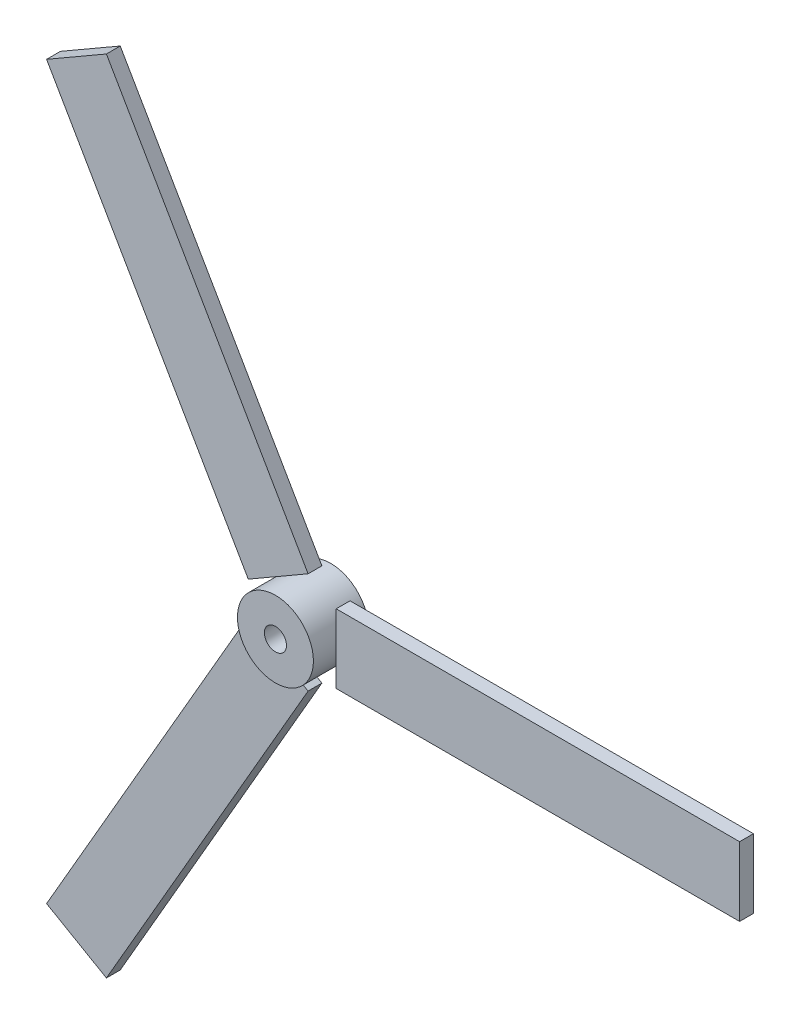
ISO-10303-21;
HEADER;
FILE_DESCRIPTION(('STEP AP214'),'2;1');
FILE_NAME('part.step','',(''),(''),'','','');
FILE_SCHEMA(('AUTOMOTIVE_DESIGN { 1 0 10303 214 1 1 1 1 }'));
ENDSEC;
DATA;
#1=APPLICATION_CONTEXT('core data for automotive mechanical design processes');
#2=APPLICATION_PROTOCOL_DEFINITION('international standard','automotive_design',2000,#1);
#3=PRODUCT_CONTEXT('',#1,'mechanical');
#4=PRODUCT('Part','Part','',(#3));
#5=PRODUCT_RELATED_PRODUCT_CATEGORY('part','',(#4));
#6=PRODUCT_DEFINITION_FORMATION('','',#4);
#7=PRODUCT_DEFINITION_CONTEXT('part definition',#1,'design');
#8=PRODUCT_DEFINITION('design','',#6,#7);
#9=PRODUCT_DEFINITION_SHAPE('','',#8);
#10=(LENGTH_UNIT() NAMED_UNIT(*) SI_UNIT(.MILLI.,.METRE.));
#11=(NAMED_UNIT(*) PLANE_ANGLE_UNIT() SI_UNIT($,.RADIAN.));
#12=(NAMED_UNIT(*) SI_UNIT($,.STERADIAN.) SOLID_ANGLE_UNIT());
#13=UNCERTAINTY_MEASURE_WITH_UNIT(LENGTH_MEASURE(1.E-05),#10,'distance_accuracy_value','');
#14=(GEOMETRIC_REPRESENTATION_CONTEXT(3) GLOBAL_UNCERTAINTY_ASSIGNED_CONTEXT((#13)) GLOBAL_UNIT_ASSIGNED_CONTEXT((#10,
#11,#12)) REPRESENTATION_CONTEXT('',''));
#15=CARTESIAN_POINT('',(0.,0.,0.));
#16=DIRECTION('',(0.,0.,1.));
#17=DIRECTION('',(1.,0.,0.));
#18=AXIS2_PLACEMENT_3D('',#15,#16,#17);
#19=CARTESIAN_POINT('',(45.573032047473,45.573032047473,13.4));
#20=DIRECTION('',(0.,0.,1.));
#21=DIRECTION('',(1.,0.,0.));
#22=AXIS2_PLACEMENT_3D('',#19,#20,#21);
#23=PLANE('',#22);
#24=CARTESIAN_POINT('',(45.573032047473,45.573032047473,13.4));
#25=DIRECTION('',(0.,0.,1.));
#26=DIRECTION('',(1.,0.,0.));
#27=AXIS2_PLACEMENT_3D('',#24,#25,#26);
#28=CIRCLE('',#27,0.8);
#29=CARTESIAN_POINT('',(46.373032047473,45.573032047473,13.4));
#30=VERTEX_POINT('',#29);
#31=EDGE_CURVE('P0_E27',#30,#30,#28,.T.);
#32=ORIENTED_EDGE('',*,*,#31,.F.);
#33=EDGE_LOOP('',(#32));
#34=FACE_BOUND('',#33,.T.);
#35=CARTESIAN_POINT('',(45.573032047473,45.573032047473,13.4));
#36=DIRECTION('',(0.,0.,1.));
#37=DIRECTION('',(1.,0.,0.));
#38=AXIS2_PLACEMENT_3D('',#35,#36,#37);
#39=CIRCLE('',#38,2.75);
#40=CARTESIAN_POINT('',(48.323032047473,45.573032047473,13.4));
#41=VERTEX_POINT('',#40);
#42=EDGE_CURVE('P0_E56',#41,#41,#39,.T.);
#43=ORIENTED_EDGE('',*,*,#42,.T.);
#44=EDGE_LOOP('',(#43));
#45=FACE_BOUND('',#44,.T.);
#46=ADVANCED_FACE('P0_F17',(#34,#45),#23,.T.);
#47=CARTESIAN_POINT('',(45.573032047473,45.573032047473,9.4));
#48=DIRECTION('',(0.,0.,1.));
#49=DIRECTION('',(1.,0.,0.));
#50=AXIS2_PLACEMENT_3D('',#47,#48,#49);
#51=PLANE('',#50);
#52=CARTESIAN_POINT('',(45.573032047473,45.573032047473,9.4));
#53=DIRECTION('',(0.,0.,1.));
#54=DIRECTION('',(1.,0.,0.));
#55=AXIS2_PLACEMENT_3D('',#52,#53,#54);
#56=CIRCLE('',#55,0.8);
#57=CARTESIAN_POINT('',(46.373032047473,45.573032047473,9.4));
#58=VERTEX_POINT('',#57);
#59=EDGE_CURVE('P0_E11',#58,#58,#56,.T.);
#60=ORIENTED_EDGE('',*,*,#59,.T.);
#61=EDGE_LOOP('',(#60));
#62=FACE_BOUND('',#61,.T.);
#63=CARTESIAN_POINT('',(45.573032047473,45.573032047473,9.4));
#64=DIRECTION('',(0.,0.,1.));
#65=DIRECTION('',(1.,0.,0.));
#66=AXIS2_PLACEMENT_3D('',#63,#64,#65);
#67=CIRCLE('',#66,2.75);
#68=CARTESIAN_POINT('',(48.323032047473,45.573032047473,9.4));
#69=VERTEX_POINT('',#68);
#70=EDGE_CURVE('P0_E59',#69,#69,#67,.T.);
#71=ORIENTED_EDGE('',*,*,#70,.F.);
#72=EDGE_LOOP('',(#71));
#73=FACE_BOUND('',#72,.T.);
#74=ADVANCED_FACE('P0_F19',(#62,#73),#51,.F.);
#75=CARTESIAN_POINT('',(45.573032047473,45.573032047473,9.4));
#76=DIRECTION('',(0.,0.,-1.));
#77=DIRECTION('',(1.,0.,0.));
#78=AXIS2_PLACEMENT_3D('',#75,#76,#77);
#79=CYLINDRICAL_SURFACE('',#78,0.8);
#80=DIRECTION('',(0.,0.,1.));
#81=VECTOR('',#80,1.);
#82=CARTESIAN_POINT('',(46.373032047473,45.573032047473,9.4));
#83=LINE('',#82,#81);
#84=EDGE_CURVE('P0_E65',#58,#30,#83,.T.);
#85=ORIENTED_EDGE('',*,*,#84,.T.);
#86=ORIENTED_EDGE('',*,*,#31,.T.);
#87=ORIENTED_EDGE('',*,*,#84,.F.);
#88=ORIENTED_EDGE('',*,*,#59,.F.);
#89=EDGE_LOOP('',(#85,#86,#87,#88));
#90=FACE_BOUND('',#89,.T.);
#91=ADVANCED_FACE('P0_F82',(#90),#79,.F.);
#92=CARTESIAN_POINT('',(45.573032047473,45.573032047473,9.4));
#93=DIRECTION('',(0.,0.,-1.));
#94=DIRECTION('',(1.,0.,0.));
#95=AXIS2_PLACEMENT_3D('',#92,#93,#94);
#96=CYLINDRICAL_SURFACE('',#95,2.75);
#97=ORIENTED_EDGE('',*,*,#70,.T.);
#98=DIRECTION('',(0.,0.,1.));
#99=VECTOR('',#98,1.);
#100=CARTESIAN_POINT('',(48.323032047473,45.573032047473,9.4));
#101=LINE('',#100,#99);
#102=EDGE_CURVE('P0_E54',#69,#41,#101,.T.);
#103=ORIENTED_EDGE('',*,*,#102,.T.);
#104=ORIENTED_EDGE('',*,*,#42,.F.);
#105=ORIENTED_EDGE('',*,*,#102,.F.);
#106=EDGE_LOOP('',(#97,#103,#104,#105));
#107=FACE_BOUND('',#106,.T.);
#108=ADVANCED_FACE('P0_F57',(#107),#96,.T.);
#109=CLOSED_SHELL('',(#46,#74,#91,#108));
#110=MANIFOLD_SOLID_BREP('P0_B1',#109);
#111=CARTESIAN_POINT('',(62.973032047473,45.573032047473,11.8));
#112=DIRECTION('',(0.,0.,1.));
#113=DIRECTION('',(1.,0.,0.));
#114=AXIS2_PLACEMENT_3D('',#111,#112,#113);
#115=PLANE('',#114);
#116=DIRECTION('',(1.,0.,0.));
#117=VECTOR('',#116,1.);
#118=CARTESIAN_POINT('',(48.373032047473,43.073032047473,11.8));
#119=LINE('',#118,#117);
#120=CARTESIAN_POINT('',(48.373032047473,43.073032047473,11.8));
#121=VERTEX_POINT('',#120);
#122=CARTESIAN_POINT('',(77.573032047473,43.073032047473,11.8));
#123=VERTEX_POINT('',#122);
#124=EDGE_CURVE('P1_E81',#121,#123,#119,.T.);
#125=ORIENTED_EDGE('',*,*,#124,.T.);
#126=DIRECTION('',(0.,1.,0.));
#127=VECTOR('',#126,1.);
#128=CARTESIAN_POINT('',(77.573032047473,43.073032047473,11.8));
#129=LINE('',#128,#127);
#130=CARTESIAN_POINT('',(77.573032047473,48.073032047473,11.8));
#131=VERTEX_POINT('',#130);
#132=EDGE_CURVE('P1_E103',#123,#131,#129,.T.);
#133=ORIENTED_EDGE('',*,*,#132,.T.);
#134=DIRECTION('',(-1.,0.,0.));
#135=VECTOR('',#134,1.);
#136=CARTESIAN_POINT('',(77.573032047473,48.073032047473,11.8));
#137=LINE('',#136,#135);
#138=CARTESIAN_POINT('',(48.373032047473,48.073032047473,11.8));
#139=VERTEX_POINT('',#138);
#140=EDGE_CURVE('P1_E72',#131,#139,#137,.T.);
#141=ORIENTED_EDGE('',*,*,#140,.T.);
#142=DIRECTION('',(0.,-1.,0.));
#143=VECTOR('',#142,1.);
#144=CARTESIAN_POINT('',(48.373032047473,48.073032047473,11.8));
#145=LINE('',#144,#143);
#146=EDGE_CURVE('P1_E11',#139,#121,#145,.T.);
#147=ORIENTED_EDGE('',*,*,#146,.T.);
#148=EDGE_LOOP('',(#125,#133,#141,#147));
#149=FACE_BOUND('',#148,.T.);
#150=ADVANCED_FACE('P1_F17',(#149),#115,.T.);
#151=CARTESIAN_POINT('',(62.973032047473,45.573032047473,10.8));
#152=DIRECTION('',(0.,0.,1.));
#153=DIRECTION('',(1.,0.,0.));
#154=AXIS2_PLACEMENT_3D('',#151,#152,#153);
#155=PLANE('',#154);
#156=DIRECTION('',(0.,-1.,0.));
#157=VECTOR('',#156,1.);
#158=CARTESIAN_POINT('',(48.373032047473,48.073032047473,10.8));
#159=LINE('',#158,#157);
#160=CARTESIAN_POINT('',(48.373032047473,48.073032047473,10.8));
#161=VERTEX_POINT('',#160);
#162=CARTESIAN_POINT('',(48.373032047473,43.073032047473,10.8));
#163=VERTEX_POINT('',#162);
#164=EDGE_CURVE('P1_E20',#161,#163,#159,.T.);
#165=ORIENTED_EDGE('',*,*,#164,.F.);
#166=DIRECTION('',(-1.,0.,0.));
#167=VECTOR('',#166,1.);
#168=CARTESIAN_POINT('',(77.573032047473,48.073032047473,10.8));
#169=LINE('',#168,#167);
#170=CARTESIAN_POINT('',(77.573032047473,48.073032047473,10.8));
#171=VERTEX_POINT('',#170);
#172=EDGE_CURVE('P1_E110',#171,#161,#169,.T.);
#173=ORIENTED_EDGE('',*,*,#172,.F.);
#174=DIRECTION('',(0.,1.,0.));
#175=VECTOR('',#174,1.);
#176=CARTESIAN_POINT('',(77.573032047473,43.073032047473,10.8));
#177=LINE('',#176,#175);
#178=CARTESIAN_POINT('',(77.573032047473,43.073032047473,10.8));
#179=VERTEX_POINT('',#178);
#180=EDGE_CURVE('P1_E83',#179,#171,#177,.T.);
#181=ORIENTED_EDGE('',*,*,#180,.F.);
#182=DIRECTION('',(1.,0.,0.));
#183=VECTOR('',#182,1.);
#184=CARTESIAN_POINT('',(48.373032047473,43.073032047473,10.8));
#185=LINE('',#184,#183);
#186=EDGE_CURVE('P1_E78',#163,#179,#185,.T.);
#187=ORIENTED_EDGE('',*,*,#186,.F.);
#188=EDGE_LOOP('',(#165,#173,#181,#187));
#189=FACE_BOUND('',#188,.T.);
#190=ADVANCED_FACE('P1_F84',(#189),#155,.F.);
#191=CARTESIAN_POINT('',(48.373032047473,48.073032047473,10.8));
#192=DIRECTION('',(1.,0.,0.));
#193=DIRECTION('',(0.,1.,0.));
#194=AXIS2_PLACEMENT_3D('',#191,#192,#193);
#195=PLANE('',#194);
#196=ORIENTED_EDGE('',*,*,#164,.T.);
#197=DIRECTION('',(0.,0.,1.));
#198=VECTOR('',#197,1.);
#199=CARTESIAN_POINT('',(48.373032047473,43.073032047473,10.8));
#200=LINE('',#199,#198);
#201=EDGE_CURVE('P1_E68',#163,#121,#200,.T.);
#202=ORIENTED_EDGE('',*,*,#201,.T.);
#203=ORIENTED_EDGE('',*,*,#146,.F.);
#204=DIRECTION('',(0.,0.,1.));
#205=VECTOR('',#204,1.);
#206=CARTESIAN_POINT('',(48.373032047473,48.073032047473,10.8));
#207=LINE('',#206,#205);
#208=EDGE_CURVE('P1_E75',#161,#139,#207,.T.);
#209=ORIENTED_EDGE('',*,*,#208,.F.);
#210=EDGE_LOOP('',(#196,#202,#203,#209));
#211=FACE_BOUND('',#210,.T.);
#212=ADVANCED_FACE('P1_F70',(#211),#195,.F.);
#213=CARTESIAN_POINT('',(77.573032047473,48.073032047473,10.8));
#214=DIRECTION('',(0.,-1.,0.));
#215=DIRECTION('',(0.,0.,-1.));
#216=AXIS2_PLACEMENT_3D('',#213,#214,#215);
#217=PLANE('',#216);
#218=ORIENTED_EDGE('',*,*,#172,.T.);
#219=ORIENTED_EDGE('',*,*,#208,.T.);
#220=ORIENTED_EDGE('',*,*,#140,.F.);
#221=DIRECTION('',(0.,0.,1.));
#222=VECTOR('',#221,1.);
#223=CARTESIAN_POINT('',(77.573032047473,48.073032047473,10.8));
#224=LINE('',#223,#222);
#225=EDGE_CURVE('P1_E97',#171,#131,#224,.T.);
#226=ORIENTED_EDGE('',*,*,#225,.F.);
#227=EDGE_LOOP('',(#218,#219,#220,#226));
#228=FACE_BOUND('',#227,.T.);
#229=ADVANCED_FACE('P1_F117',(#228),#217,.F.);
#230=CARTESIAN_POINT('',(77.573032047473,43.073032047473,10.8));
#231=DIRECTION('',(-1.,0.,0.));
#232=DIRECTION('',(0.,0.,1.));
#233=AXIS2_PLACEMENT_3D('',#230,#231,#232);
#234=PLANE('',#233);
#235=ORIENTED_EDGE('',*,*,#180,.T.);
#236=ORIENTED_EDGE('',*,*,#225,.T.);
#237=ORIENTED_EDGE('',*,*,#132,.F.);
#238=DIRECTION('',(0.,0.,1.));
#239=VECTOR('',#238,1.);
#240=CARTESIAN_POINT('',(77.573032047473,43.073032047473,10.8));
#241=LINE('',#240,#239);
#242=EDGE_CURVE('P1_E90',#179,#123,#241,.T.);
#243=ORIENTED_EDGE('',*,*,#242,.F.);
#244=EDGE_LOOP('',(#235,#236,#237,#243));
#245=FACE_BOUND('',#244,.T.);
#246=ADVANCED_FACE('P1_F118',(#245),#234,.F.);
#247=CARTESIAN_POINT('',(48.373032047473,43.073032047473,10.8));
#248=DIRECTION('',(0.,1.,0.));
#249=DIRECTION('',(1.,0.,0.));
#250=AXIS2_PLACEMENT_3D('',#247,#248,#249);
#251=PLANE('',#250);
#252=ORIENTED_EDGE('',*,*,#186,.T.);
#253=ORIENTED_EDGE('',*,*,#242,.T.);
#254=ORIENTED_EDGE('',*,*,#124,.F.);
#255=ORIENTED_EDGE('',*,*,#201,.F.);
#256=EDGE_LOOP('',(#252,#253,#254,#255));
#257=FACE_BOUND('',#256,.T.);
#258=ADVANCED_FACE('P1_F80',(#257),#251,.F.);
#259=CLOSED_SHELL('',(#150,#190,#212,#229,#246,#258));
#260=MANIFOLD_SOLID_BREP('P1_B1',#259);
#261=CARTESIAN_POINT('',(36.873032047473,60.641874073322,11.8));
#262=DIRECTION('',(0.,0.,1.));
#263=DIRECTION('',(1.,0.,0.));
#264=AXIS2_PLACEMENT_3D('',#261,#262,#263);
#265=PLANE('',#264);
#266=DIRECTION('',(-0.50000000000019,0.866025403784329,0.));
#267=VECTOR('',#266,1.);
#268=CARTESIAN_POINT('',(46.338095556934,49.247903178069,11.8));
#269=LINE('',#268,#267);
#270=CARTESIAN_POINT('',(46.338095556934,49.247903178069,11.8));
#271=VERTEX_POINT('',#270);
#272=CARTESIAN_POINT('',(31.738095556934,74.535844968575,11.8));
#273=VERTEX_POINT('',#272);
#274=EDGE_CURVE('P2_E98',#271,#273,#269,.T.);
#275=ORIENTED_EDGE('',*,*,#274,.T.);
#276=DIRECTION('',(-0.866025403784329,-0.50000000000019,0.));
#277=VECTOR('',#276,1.);
#278=CARTESIAN_POINT('',(31.738095556934,74.535844968575,11.8));
#279=LINE('',#278,#277);
#280=CARTESIAN_POINT('',(27.407968538012,72.035844968575,11.8));
#281=VERTEX_POINT('',#280);
#282=EDGE_CURVE('P2_E78',#273,#281,#279,.T.);
#283=ORIENTED_EDGE('',*,*,#282,.T.);
#284=DIRECTION('',(0.50000000000019,-0.866025403784329,0.));
#285=VECTOR('',#284,1.);
#286=CARTESIAN_POINT('',(27.407968538012,72.035844968575,11.8));
#287=LINE('',#286,#285);
#288=CARTESIAN_POINT('',(42.007968538012,46.747903178069,11.8));
#289=VERTEX_POINT('',#288);
#290=EDGE_CURVE('P2_E62',#281,#289,#287,.T.);
#291=ORIENTED_EDGE('',*,*,#290,.T.);
#292=DIRECTION('',(0.866025403784329,0.50000000000019,0.));
#293=VECTOR('',#292,1.);
#294=CARTESIAN_POINT('',(42.007968538012,46.747903178069,11.8));
#295=LINE('',#294,#293);
#296=EDGE_CURVE('P2_E11',#289,#271,#295,.T.);
#297=ORIENTED_EDGE('',*,*,#296,.T.);
#298=EDGE_LOOP('',(#275,#283,#291,#297));
#299=FACE_BOUND('',#298,.T.);
#300=ADVANCED_FACE('P2_F17',(#299),#265,.T.);
#301=CARTESIAN_POINT('',(36.873032047473,60.641874073322,10.8));
#302=DIRECTION('',(0.,0.,1.));
#303=DIRECTION('',(1.,0.,0.));
#304=AXIS2_PLACEMENT_3D('',#301,#302,#303);
#305=PLANE('',#304);
#306=DIRECTION('',(0.866025403784329,0.50000000000019,0.));
#307=VECTOR('',#306,1.);
#308=CARTESIAN_POINT('',(42.007968538012,46.747903178069,10.8));
#309=LINE('',#308,#307);
#310=CARTESIAN_POINT('',(42.007968538012,46.747903178069,10.8));
#311=VERTEX_POINT('',#310);
#312=CARTESIAN_POINT('',(46.338095556934,49.247903178069,10.8));
#313=VERTEX_POINT('',#312);
#314=EDGE_CURVE('P2_E20',#311,#313,#309,.T.);
#315=ORIENTED_EDGE('',*,*,#314,.F.);
#316=DIRECTION('',(0.50000000000019,-0.866025403784329,0.));
#317=VECTOR('',#316,1.);
#318=CARTESIAN_POINT('',(27.407968538012,72.035844968575,10.8));
#319=LINE('',#318,#317);
#320=CARTESIAN_POINT('',(27.407968538012,72.035844968575,10.8));
#321=VERTEX_POINT('',#320);
#322=EDGE_CURVE('P2_E69',#321,#311,#319,.T.);
#323=ORIENTED_EDGE('',*,*,#322,.F.);
#324=DIRECTION('',(-0.866025403784329,-0.50000000000019,0.));
#325=VECTOR('',#324,1.);
#326=CARTESIAN_POINT('',(31.738095556934,74.535844968575,10.8));
#327=LINE('',#326,#325);
#328=CARTESIAN_POINT('',(31.738095556934,74.535844968575,10.8));
#329=VERTEX_POINT('',#328);
#330=EDGE_CURVE('P2_E72',#329,#321,#327,.T.);
#331=ORIENTED_EDGE('',*,*,#330,.F.);
#332=DIRECTION('',(-0.50000000000019,0.866025403784329,0.));
#333=VECTOR('',#332,1.);
#334=CARTESIAN_POINT('',(46.338095556934,49.247903178069,10.8));
#335=LINE('',#334,#333);
#336=EDGE_CURVE('P2_E105',#313,#329,#335,.T.);
#337=ORIENTED_EDGE('',*,*,#336,.F.);
#338=EDGE_LOOP('',(#315,#323,#331,#337));
#339=FACE_BOUND('',#338,.T.);
#340=ADVANCED_FACE('P2_F75',(#339),#305,.F.);
#341=CARTESIAN_POINT('',(42.007968538012,46.747903178069,10.8));
#342=DIRECTION('',(-0.50000000000019,0.866025403784329,0.));
#343=DIRECTION('',(0.,0.,1.));
#344=AXIS2_PLACEMENT_3D('',#341,#342,#343);
#345=PLANE('',#344);
#346=ORIENTED_EDGE('',*,*,#314,.T.);
#347=DIRECTION('',(0.,0.,1.));
#348=VECTOR('',#347,1.);
#349=CARTESIAN_POINT('',(46.338095556934,49.247903178069,10.8));
#350=LINE('',#349,#348);
#351=EDGE_CURVE('P2_E95',#313,#271,#350,.T.);
#352=ORIENTED_EDGE('',*,*,#351,.T.);
#353=ORIENTED_EDGE('',*,*,#296,.F.);
#354=DIRECTION('',(0.,0.,1.));
#355=VECTOR('',#354,1.);
#356=CARTESIAN_POINT('',(42.007968538012,46.747903178069,10.8));
#357=LINE('',#356,#355);
#358=EDGE_CURVE('P2_E77',#311,#289,#357,.T.);
#359=ORIENTED_EDGE('',*,*,#358,.F.);
#360=EDGE_LOOP('',(#346,#352,#353,#359));
#361=FACE_BOUND('',#360,.T.);
#362=ADVANCED_FACE('P2_F114',(#361),#345,.F.);
#363=CARTESIAN_POINT('',(27.407968538012,72.035844968575,10.8));
#364=DIRECTION('',(0.866025403784329,0.50000000000019,0.));
#365=DIRECTION('',(0.,0.,-1.));
#366=AXIS2_PLACEMENT_3D('',#363,#364,#365);
#367=PLANE('',#366);
#368=ORIENTED_EDGE('',*,*,#322,.T.);
#369=ORIENTED_EDGE('',*,*,#358,.T.);
#370=ORIENTED_EDGE('',*,*,#290,.F.);
#371=DIRECTION('',(0.,0.,1.));
#372=VECTOR('',#371,1.);
#373=CARTESIAN_POINT('',(27.407968538012,72.035844968575,10.8));
#374=LINE('',#373,#372);
#375=EDGE_CURVE('P2_E85',#321,#281,#374,.T.);
#376=ORIENTED_EDGE('',*,*,#375,.F.);
#377=EDGE_LOOP('',(#368,#369,#370,#376));
#378=FACE_BOUND('',#377,.T.);
#379=ADVANCED_FACE('P2_F83',(#378),#367,.F.);
#380=CARTESIAN_POINT('',(31.738095556934,74.535844968575,10.8));
#381=DIRECTION('',(0.50000000000019,-0.866025403784329,0.));
#382=DIRECTION('',(0.,0.,-1.));
#383=AXIS2_PLACEMENT_3D('',#380,#381,#382);
#384=PLANE('',#383);
#385=ORIENTED_EDGE('',*,*,#330,.T.);
#386=ORIENTED_EDGE('',*,*,#375,.T.);
#387=ORIENTED_EDGE('',*,*,#282,.F.);
#388=DIRECTION('',(0.,0.,1.));
#389=VECTOR('',#388,1.);
#390=CARTESIAN_POINT('',(31.738095556934,74.535844968575,10.8));
#391=LINE('',#390,#389);
#392=EDGE_CURVE('P2_E90',#329,#273,#391,.T.);
#393=ORIENTED_EDGE('',*,*,#392,.F.);
#394=EDGE_LOOP('',(#385,#386,#387,#393));
#395=FACE_BOUND('',#394,.T.);
#396=ADVANCED_FACE('P2_F87',(#395),#384,.F.);
#397=CARTESIAN_POINT('',(46.338095556934,49.247903178069,10.8));
#398=DIRECTION('',(-0.866025403784329,-0.50000000000019,0.));
#399=DIRECTION('',(-0.50000000000019,0.866025403784329,0.));
#400=AXIS2_PLACEMENT_3D('',#397,#398,#399);
#401=PLANE('',#400);
#402=ORIENTED_EDGE('',*,*,#336,.T.);
#403=ORIENTED_EDGE('',*,*,#392,.T.);
#404=ORIENTED_EDGE('',*,*,#274,.F.);
#405=ORIENTED_EDGE('',*,*,#351,.F.);
#406=EDGE_LOOP('',(#402,#403,#404,#405));
#407=FACE_BOUND('',#406,.T.);
#408=ADVANCED_FACE('P2_F117',(#407),#401,.F.);
#409=CLOSED_SHELL('',(#300,#340,#362,#379,#396,#408));
#410=MANIFOLD_SOLID_BREP('P2_B1',#409);
#411=CARTESIAN_POINT('',(36.873032047473,30.504190021624,11.8));
#412=DIRECTION('',(0.,0.,1.));
#413=DIRECTION('',(1.,0.,0.));
#414=AXIS2_PLACEMENT_3D('',#411,#412,#413);
#415=PLANE('',#414);
#416=DIRECTION('',(-0.50000000000019,-0.866025403784329,0.));
#417=VECTOR('',#416,1.);
#418=CARTESIAN_POINT('',(42.007968538012,44.398160916877,11.8));
#419=LINE('',#418,#417);
#420=CARTESIAN_POINT('',(42.007968538012,44.398160916877,11.8));
#421=VERTEX_POINT('',#420);
#422=CARTESIAN_POINT('',(27.407968538012,19.110219126371,11.8));
#423=VERTEX_POINT('',#422);
#424=EDGE_CURVE('P3_E78',#421,#423,#419,.T.);
#425=ORIENTED_EDGE('',*,*,#424,.T.);
#426=DIRECTION('',(0.866025403784329,-0.50000000000019,0.));
#427=VECTOR('',#426,1.);
#428=CARTESIAN_POINT('',(27.407968538012,19.110219126371,11.8));
#429=LINE('',#428,#427);
#430=CARTESIAN_POINT('',(31.738095556934,16.610219126371,11.8));
#431=VERTEX_POINT('',#430);
#432=EDGE_CURVE('P3_E103',#423,#431,#429,.T.);
#433=ORIENTED_EDGE('',*,*,#432,.T.);
#434=DIRECTION('',(0.50000000000019,0.866025403784329,0.));
#435=VECTOR('',#434,1.);
#436=CARTESIAN_POINT('',(31.738095556934,16.610219126371,11.8));
#437=LINE('',#436,#435);
#438=CARTESIAN_POINT('',(46.338095556934,41.898160916877,11.8));
#439=VERTEX_POINT('',#438);
#440=EDGE_CURVE('P3_E71',#431,#439,#437,.T.);
#441=ORIENTED_EDGE('',*,*,#440,.T.);
#442=DIRECTION('',(-0.866025403784329,0.50000000000019,0.));
#443=VECTOR('',#442,1.);
#444=CARTESIAN_POINT('',(46.338095556934,41.898160916877,11.8));
#445=LINE('',#444,#443);
#446=EDGE_CURVE('P3_E10',#439,#421,#445,.T.);
#447=ORIENTED_EDGE('',*,*,#446,.T.);
#448=EDGE_LOOP('',(#425,#433,#441,#447));
#449=FACE_BOUND('',#448,.T.);
#450=ADVANCED_FACE('P3_F16',(#449),#415,.T.);
#451=CARTESIAN_POINT('',(36.873032047473,30.504190021624,10.8));
#452=DIRECTION('',(0.,0.,1.));
#453=DIRECTION('',(1.,0.,0.));
#454=AXIS2_PLACEMENT_3D('',#451,#452,#453);
#455=PLANE('',#454);
#456=DIRECTION('',(-0.866025403784329,0.50000000000019,0.));
#457=VECTOR('',#456,1.);
#458=CARTESIAN_POINT('',(46.338095556934,41.898160916877,10.8));
#459=LINE('',#458,#457);
#460=CARTESIAN_POINT('',(46.338095556934,41.898160916877,10.8));
#461=VERTEX_POINT('',#460);
#462=CARTESIAN_POINT('',(42.007968538012,44.398160916877,10.8));
#463=VERTEX_POINT('',#462);
#464=EDGE_CURVE('P3_E19',#461,#463,#459,.T.);
#465=ORIENTED_EDGE('',*,*,#464,.F.);
#466=DIRECTION('',(0.50000000000019,0.866025403784329,0.));
#467=VECTOR('',#466,1.);
#468=CARTESIAN_POINT('',(31.738095556934,16.610219126371,10.8));
#469=LINE('',#468,#467);
#470=CARTESIAN_POINT('',(31.738095556934,16.610219126371,10.8));
#471=VERTEX_POINT('',#470);
#472=EDGE_CURVE('P3_E110',#471,#461,#469,.T.);
#473=ORIENTED_EDGE('',*,*,#472,.F.);
#474=DIRECTION('',(0.866025403784329,-0.50000000000019,0.));
#475=VECTOR('',#474,1.);
#476=CARTESIAN_POINT('',(27.407968538012,19.110219126371,10.8));
#477=LINE('',#476,#475);
#478=CARTESIAN_POINT('',(27.407968538012,19.110219126371,10.8));
#479=VERTEX_POINT('',#478);
#480=EDGE_CURVE('P3_E81',#479,#471,#477,.T.);
#481=ORIENTED_EDGE('',*,*,#480,.F.);
#482=DIRECTION('',(-0.50000000000019,-0.866025403784329,0.));
#483=VECTOR('',#482,1.);
#484=CARTESIAN_POINT('',(42.007968538012,44.398160916877,10.8));
#485=LINE('',#484,#483);
#486=EDGE_CURVE('P3_E80',#463,#479,#485,.T.);
#487=ORIENTED_EDGE('',*,*,#486,.F.);
#488=EDGE_LOOP('',(#465,#473,#481,#487));
#489=FACE_BOUND('',#488,.T.);
#490=ADVANCED_FACE('P3_F83',(#489),#455,.F.);
#491=CARTESIAN_POINT('',(46.338095556934,41.898160916877,10.8));
#492=DIRECTION('',(-0.50000000000019,-0.866025403784329,0.));
#493=DIRECTION('',(-0.866025403784329,0.50000000000019,0.));
#494=AXIS2_PLACEMENT_3D('',#491,#492,#493);
#495=PLANE('',#494);
#496=ORIENTED_EDGE('',*,*,#464,.T.);
#497=DIRECTION('',(0.,0.,1.));
#498=VECTOR('',#497,1.);
#499=CARTESIAN_POINT('',(42.007968538012,44.398160916877,10.8));
#500=LINE('',#499,#498);
#501=EDGE_CURVE('P3_E63',#463,#421,#500,.T.);
#502=ORIENTED_EDGE('',*,*,#501,.T.);
#503=ORIENTED_EDGE('',*,*,#446,.F.);
#504=DIRECTION('',(0.,0.,1.));
#505=VECTOR('',#504,1.);
#506=CARTESIAN_POINT('',(46.338095556934,41.898160916877,10.8));
#507=LINE('',#506,#505);
#508=EDGE_CURVE('P3_E70',#461,#439,#507,.T.);
#509=ORIENTED_EDGE('',*,*,#508,.F.);
#510=EDGE_LOOP('',(#496,#502,#503,#509));
#511=FACE_BOUND('',#510,.T.);
#512=ADVANCED_FACE('P3_F64',(#511),#495,.F.);
#513=CARTESIAN_POINT('',(31.738095556934,16.610219126371,10.8));
#514=DIRECTION('',(-0.866025403784329,0.50000000000019,0.));
#515=DIRECTION('',(0.,0.,1.));
#516=AXIS2_PLACEMENT_3D('',#513,#514,#515);
#517=PLANE('',#516);
#518=ORIENTED_EDGE('',*,*,#472,.T.);
#519=ORIENTED_EDGE('',*,*,#508,.T.);
#520=ORIENTED_EDGE('',*,*,#440,.F.);
#521=DIRECTION('',(0.,0.,1.));
#522=VECTOR('',#521,1.);
#523=CARTESIAN_POINT('',(31.738095556934,16.610219126371,10.8));
#524=LINE('',#523,#522);
#525=EDGE_CURVE('P3_E98',#471,#431,#524,.T.);
#526=ORIENTED_EDGE('',*,*,#525,.F.);
#527=EDGE_LOOP('',(#518,#519,#520,#526));
#528=FACE_BOUND('',#527,.T.);
#529=ADVANCED_FACE('P3_F114',(#528),#517,.F.);
#530=CARTESIAN_POINT('',(27.407968538012,19.110219126371,10.8));
#531=DIRECTION('',(0.50000000000019,0.866025403784329,0.));
#532=DIRECTION('',(0.,0.,-1.));
#533=AXIS2_PLACEMENT_3D('',#530,#531,#532);
#534=PLANE('',#533);
#535=ORIENTED_EDGE('',*,*,#480,.T.);
#536=ORIENTED_EDGE('',*,*,#525,.T.);
#537=ORIENTED_EDGE('',*,*,#432,.F.);
#538=DIRECTION('',(0.,0.,1.));
#539=VECTOR('',#538,1.);
#540=CARTESIAN_POINT('',(27.407968538012,19.110219126371,10.8));
#541=LINE('',#540,#539);
#542=EDGE_CURVE('P3_E87',#479,#423,#541,.T.);
#543=ORIENTED_EDGE('',*,*,#542,.F.);
#544=EDGE_LOOP('',(#535,#536,#537,#543));
#545=FACE_BOUND('',#544,.T.);
#546=ADVANCED_FACE('P3_F113',(#545),#534,.F.);
#547=CARTESIAN_POINT('',(42.007968538012,44.398160916877,10.8));
#548=DIRECTION('',(0.866025403784329,-0.50000000000019,0.));
#549=DIRECTION('',(0.,0.,-1.));
#550=AXIS2_PLACEMENT_3D('',#547,#548,#549);
#551=PLANE('',#550);
#552=ORIENTED_EDGE('',*,*,#486,.T.);
#553=ORIENTED_EDGE('',*,*,#542,.T.);
#554=ORIENTED_EDGE('',*,*,#424,.F.);
#555=ORIENTED_EDGE('',*,*,#501,.F.);
#556=EDGE_LOOP('',(#552,#553,#554,#555));
#557=FACE_BOUND('',#556,.T.);
#558=ADVANCED_FACE('P3_F74',(#557),#551,.F.);
#559=CLOSED_SHELL('',(#450,#490,#512,#529,#546,#558));
#560=MANIFOLD_SOLID_BREP('P3_B1',#559);
#561=ADVANCED_BREP_SHAPE_REPRESENTATION('',(#18,#110,#260,#410,#560),#14);
#562=SHAPE_DEFINITION_REPRESENTATION(#9,#561);
ENDSEC;
END-ISO-10303-21;
